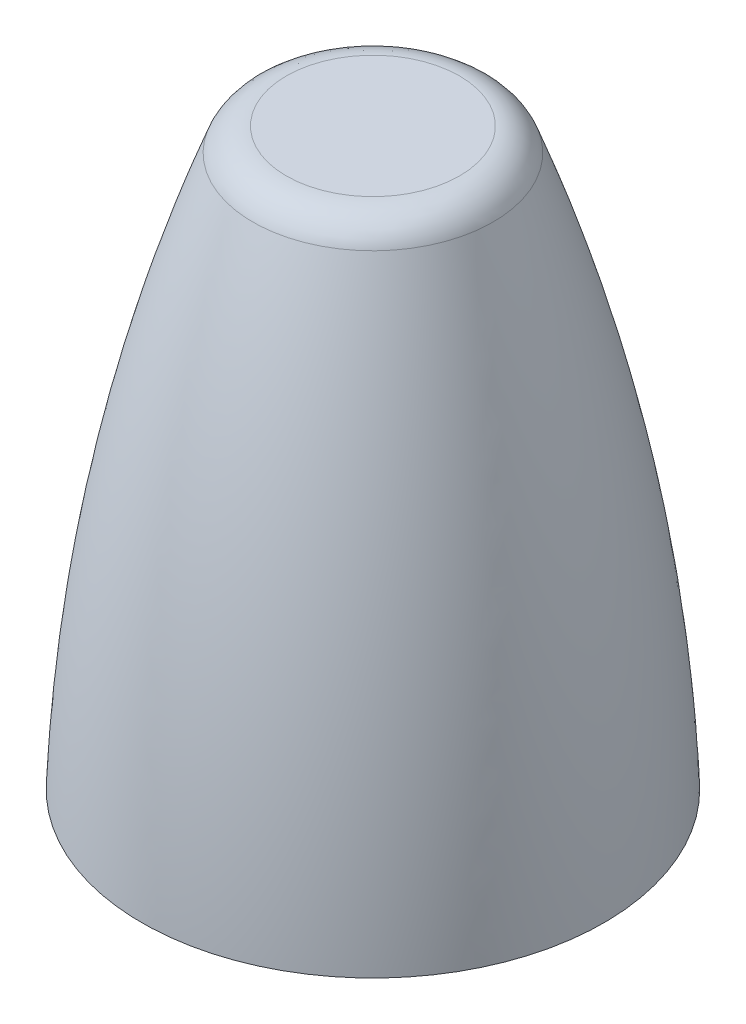
ISO-10303-21;
HEADER;
FILE_DESCRIPTION(('STEP AP214'),'2;1');
FILE_NAME('part.step','',(''),(''),'','','');
FILE_SCHEMA(('AUTOMOTIVE_DESIGN { 1 0 10303 214 1 1 1 1 }'));
ENDSEC;
DATA;
#1=APPLICATION_CONTEXT('core data for automotive mechanical design processes');
#2=APPLICATION_PROTOCOL_DEFINITION('international standard','automotive_design',2000,#1);
#3=PRODUCT_CONTEXT('',#1,'mechanical');
#4=PRODUCT('Part','Part','',(#3));
#5=PRODUCT_RELATED_PRODUCT_CATEGORY('part','',(#4));
#6=PRODUCT_DEFINITION_FORMATION('','',#4);
#7=PRODUCT_DEFINITION_CONTEXT('part definition',#1,'design');
#8=PRODUCT_DEFINITION('design','',#6,#7);
#9=PRODUCT_DEFINITION_SHAPE('','',#8);
#10=(LENGTH_UNIT() NAMED_UNIT(*) SI_UNIT(.MILLI.,.METRE.));
#11=(NAMED_UNIT(*) PLANE_ANGLE_UNIT() SI_UNIT($,.RADIAN.));
#12=(NAMED_UNIT(*) SI_UNIT($,.STERADIAN.) SOLID_ANGLE_UNIT());
#13=UNCERTAINTY_MEASURE_WITH_UNIT(LENGTH_MEASURE(1.E-05),#10,'distance_accuracy_value','');
#14=(GEOMETRIC_REPRESENTATION_CONTEXT(3) GLOBAL_UNCERTAINTY_ASSIGNED_CONTEXT((#13)) GLOBAL_UNIT_ASSIGNED_CONTEXT((#10,
#11,#12)) REPRESENTATION_CONTEXT('',''));
#15=CARTESIAN_POINT('',(0.,0.,0.));
#16=DIRECTION('',(0.,0.,1.));
#17=DIRECTION('',(1.,0.,0.));
#18=AXIS2_PLACEMENT_3D('',#15,#16,#17);
#19=CARTESIAN_POINT('',(0.,31.4346111856191,0.));
#20=DIRECTION('',(0.,-1.,0.));
#21=DIRECTION('',(0.,0.,-1.));
#22=AXIS2_PLACEMENT_3D('',#19,#20,#21);
#23=PLANE('',#22);
#24=CARTESIAN_POINT('',(0.,31.4346111856594,0.));
#25=DIRECTION('',(0.,-1.,0.));
#26=DIRECTION('',(1.,0.,0.));
#27=AXIS2_PLACEMENT_3D('',#24,#25,#26);
#28=CIRCLE('',#27,5.130799999991);
#29=CARTESIAN_POINT('',(5.130799999991,31.4346111856594,0.));
#30=VERTEX_POINT('',#29);
#31=EDGE_CURVE('E115',#30,#30,#28,.T.);
#32=ORIENTED_EDGE('',*,*,#31,.T.);
#33=EDGE_LOOP('',(#32));
#34=FACE_BOUND('',#33,.T.);
#35=ADVANCED_FACE('F17',(#34),#23,.T.);
#36=CARTESIAN_POINT('',(0.,25.4097866329062,0.));
#37=DIRECTION('',(0.,-1.,0.));
#38=DIRECTION('',(1.,0.,0.));
#39=AXIS2_PLACEMENT_3D('',#36,#37,#38);
#40=CONICAL_SURFACE('',#39,6.73099999997362,0.25960730001697);
#41=CARTESIAN_POINT('',(0.,25.4097866328367,0.));
#42=DIRECTION('',(0.,-1.,0.));
#43=DIRECTION('',(0.,0.,-1.));
#44=AXIS2_PLACEMENT_3D('',#41,#42,#43);
#45=CIRCLE('',#44,6.731);
#46=CARTESIAN_POINT('',(0.,25.4097866328367,-6.731));
#47=VERTEX_POINT('',#46);
#48=EDGE_CURVE('E113',#47,#47,#45,.T.);
#49=ORIENTED_EDGE('',*,*,#48,.T.);
#50=EDGE_LOOP('',(#49));
#51=FACE_BOUND('',#50,.T.);
#52=ORIENTED_EDGE('',*,*,#31,.F.);
#53=EDGE_LOOP('',(#52));
#54=FACE_BOUND('',#53,.T.);
#55=ADVANCED_FACE('F390',(#51,#54),#40,.F.);
#56=CARTESIAN_POINT('',(0.,31.0037578537676,0.));
#57=DIRECTION('',(0.,-1.,0.));
#58=DIRECTION('',(0.,0.,-1.));
#59=AXIS2_PLACEMENT_3D('',#56,#57,#58);
#60=CYLINDRICAL_SURFACE('',#59,6.731);
#61=CARTESIAN_POINT('',(0.,24.8249911856191,0.));
#62=DIRECTION('',(0.,-1.,0.));
#63=DIRECTION('',(0.,0.,-1.));
#64=AXIS2_PLACEMENT_3D('',#61,#62,#63);
#65=CIRCLE('',#64,6.731);
#66=CARTESIAN_POINT('',(0.,24.8249911856191,-6.731));
#67=VERTEX_POINT('',#66);
#68=EDGE_CURVE('E68',#67,#67,#65,.T.);
#69=ORIENTED_EDGE('',*,*,#68,.T.);
#70=EDGE_LOOP('',(#69));
#71=FACE_BOUND('',#70,.T.);
#72=ORIENTED_EDGE('',*,*,#48,.F.);
#73=EDGE_LOOP('',(#72));
#74=FACE_BOUND('',#73,.T.);
#75=ADVANCED_FACE('F101',(#71,#74),#60,.F.);
#76=CARTESIAN_POINT('',(0.,24.8249911856191,0.));
#77=DIRECTION('',(0.,-1.,0.));
#78=DIRECTION('',(0.,0.,-1.));
#79=AXIS2_PLACEMENT_3D('',#76,#77,#78);
#80=TOROIDAL_SURFACE('',#79,6.23062,0.500380000000001);
#81=CARTESIAN_POINT('',(0.,24.3246111856191,0.));
#82=DIRECTION('',(0.,-1.,0.));
#83=DIRECTION('',(0.,0.,1.));
#84=AXIS2_PLACEMENT_3D('',#81,#82,#83);
#85=CIRCLE('',#84,6.23062);
#86=CARTESIAN_POINT('',(0.,24.3246111856191,-6.23062));
#87=VERTEX_POINT('',#86);
#88=CARTESIAN_POINT('',(0.,24.3246111856191,6.23062));
#89=VERTEX_POINT('',#88);
#90=EDGE_CURVE('E56',#87,#89,#85,.F.);
#91=ORIENTED_EDGE('',*,*,#90,.F.);
#92=CARTESIAN_POINT('',(0.,24.3246111856191,0.));
#93=DIRECTION('',(0.,-1.,0.));
#94=DIRECTION('',(0.,0.,-1.));
#95=AXIS2_PLACEMENT_3D('',#92,#93,#94);
#96=CIRCLE('',#95,6.23062);
#97=EDGE_CURVE('E54',#89,#87,#96,.F.);
#98=ORIENTED_EDGE('',*,*,#97,.F.);
#99=EDGE_LOOP('',(#91,#98));
#100=FACE_BOUND('',#99,.T.);
#101=ORIENTED_EDGE('',*,*,#68,.F.);
#102=EDGE_LOOP('',(#101));
#103=FACE_BOUND('',#102,.T.);
#104=ADVANCED_FACE('F58',(#100,#103),#80,.F.);
#105=CARTESIAN_POINT('',(0.,24.3246111856191,0.));
#106=DIRECTION('',(0.,1.,0.));
#107=DIRECTION('',(0.,0.,1.));
#108=AXIS2_PLACEMENT_3D('',#105,#106,#107);
#109=PLANE('',#108);
#110=ORIENTED_EDGE('',*,*,#97,.T.);
#111=ORIENTED_EDGE('',*,*,#90,.T.);
#112=EDGE_LOOP('',(#110,#111));
#113=FACE_BOUND('',#112,.T.);
#114=CARTESIAN_POINT('',(0.,24.3246111856191,0.));
#115=DIRECTION('',(0.,-1.,0.));
#116=DIRECTION('',(0.,0.,-1.));
#117=AXIS2_PLACEMENT_3D('',#114,#115,#116);
#118=CIRCLE('',#117,5.175);
#119=CARTESIAN_POINT('',(0.,24.3246111856191,-5.175));
#120=VERTEX_POINT('',#119);
#121=EDGE_CURVE('E62',#120,#120,#118,.T.);
#122=ORIENTED_EDGE('',*,*,#121,.T.);
#123=EDGE_LOOP('',(#122));
#124=FACE_BOUND('',#123,.T.);
#125=ADVANCED_FACE('F66',(#113,#124),#109,.T.);
#126=CARTESIAN_POINT('',(0.,31.0037578537676,0.));
#127=DIRECTION('',(0.,-1.,0.));
#128=DIRECTION('',(0.,0.,-1.));
#129=AXIS2_PLACEMENT_3D('',#126,#127,#128);
#130=CYLINDRICAL_SURFACE('',#129,5.175);
#131=CARTESIAN_POINT('',(0.,15.7722628656191,0.));
#132=DIRECTION('',(0.,-1.,0.));
#133=DIRECTION('',(0.,0.,-1.));
#134=AXIS2_PLACEMENT_3D('',#131,#132,#133);
#135=CIRCLE('',#134,5.175);
#136=CARTESIAN_POINT('',(0.,15.7722628656191,-5.175));
#137=VERTEX_POINT('',#136);
#138=EDGE_CURVE('E125',#137,#137,#135,.F.);
#139=ORIENTED_EDGE('',*,*,#138,.F.);
#140=EDGE_LOOP('',(#139));
#141=FACE_BOUND('',#140,.T.);
#142=ORIENTED_EDGE('',*,*,#121,.F.);
#143=EDGE_LOOP('',(#142));
#144=FACE_BOUND('',#143,.T.);
#145=ADVANCED_FACE('F87',(#141,#144),#130,.F.);
#146=CARTESIAN_POINT('',(0.,15.7722628656191,0.));
#147=DIRECTION('',(0.,-1.,0.));
#148=DIRECTION('',(0.,0.,-1.));
#149=AXIS2_PLACEMENT_3D('',#146,#147,#148);
#150=PLANE('',#149);
#151=ORIENTED_EDGE('',*,*,#138,.T.);
#152=EDGE_LOOP('',(#151));
#153=FACE_BOUND('',#152,.T.);
#154=CARTESIAN_POINT('',(0.,15.7722628656191,0.));
#155=DIRECTION('',(0.,1.,0.));
#156=DIRECTION('',(0.,0.,1.));
#157=AXIS2_PLACEMENT_3D('',#154,#155,#156);
#158=CIRCLE('',#157,7.779);
#159=CARTESIAN_POINT('',(0.,15.7722628656191,-7.779));
#160=VERTEX_POINT('',#159);
#161=CARTESIAN_POINT('',(0.,15.7722628656191,7.779));
#162=VERTEX_POINT('',#161);
#163=EDGE_CURVE('E218',#160,#162,#158,.F.);
#164=ORIENTED_EDGE('',*,*,#163,.T.);
#165=CARTESIAN_POINT('',(0.,15.7722628656191,0.));
#166=DIRECTION('',(0.,1.,0.));
#167=DIRECTION('',(0.,0.,-1.));
#168=AXIS2_PLACEMENT_3D('',#165,#166,#167);
#169=CIRCLE('',#168,7.779);
#170=EDGE_CURVE('E128',#162,#160,#169,.F.);
#171=ORIENTED_EDGE('',*,*,#170,.T.);
#172=EDGE_LOOP('',(#164,#171));
#173=FACE_BOUND('',#172,.T.);
#174=ADVANCED_FACE('F227',(#153,#173),#150,.T.);
#175=CARTESIAN_POINT('',(0.,13.7722628656191,0.));
#176=DIRECTION('',(0.,-1.,0.));
#177=DIRECTION('',(0.,0.,-1.));
#178=AXIS2_PLACEMENT_3D('',#175,#176,#177);
#179=TOROIDAL_SURFACE('',#178,7.779,2.);
#180=ORIENTED_EDGE('',*,*,#163,.F.);
#181=ORIENTED_EDGE('',*,*,#170,.F.);
#182=EDGE_LOOP('',(#180,#181));
#183=FACE_BOUND('',#182,.T.);
#184=CARTESIAN_POINT('',(0.,13.7722628656191,0.));
#185=DIRECTION('',(0.,-1.,0.));
#186=DIRECTION('',(0.,0.,-1.));
#187=AXIS2_PLACEMENT_3D('',#184,#185,#186);
#188=CIRCLE('',#187,9.779);
#189=CARTESIAN_POINT('',(0.,13.7722628656191,-9.779));
#190=VERTEX_POINT('',#189);
#191=EDGE_CURVE('E124',#190,#190,#188,.T.);
#192=ORIENTED_EDGE('',*,*,#191,.T.);
#193=EDGE_LOOP('',(#192));
#194=FACE_BOUND('',#193,.T.);
#195=ADVANCED_FACE('F222',(#183,#194),#179,.F.);
#196=CARTESIAN_POINT('',(0.,31.0037578537676,0.));
#197=DIRECTION('',(0.,-1.,0.));
#198=DIRECTION('',(0.,0.,-1.));
#199=AXIS2_PLACEMENT_3D('',#196,#197,#198);
#200=CYLINDRICAL_SURFACE('',#199,9.779);
#201=ORIENTED_EDGE('',*,*,#191,.F.);
#202=EDGE_LOOP('',(#201));
#203=FACE_BOUND('',#202,.T.);
#204=CARTESIAN_POINT('',(0.,9.85961118561913,0.));
#205=DIRECTION('',(0.,-1.,0.));
#206=DIRECTION('',(0.,0.,-1.));
#207=AXIS2_PLACEMENT_3D('',#204,#205,#206);
#208=CIRCLE('',#207,9.779);
#209=CARTESIAN_POINT('',(0.,9.85961118561913,-9.779));
#210=VERTEX_POINT('',#209);
#211=EDGE_CURVE('E121',#210,#210,#208,.T.);
#212=ORIENTED_EDGE('',*,*,#211,.T.);
#213=EDGE_LOOP('',(#212));
#214=FACE_BOUND('',#213,.T.);
#215=ADVANCED_FACE('F226',(#203,#214),#200,.F.);
#216=CARTESIAN_POINT('',(0.,9.85961118561913,0.));
#217=DIRECTION('',(0.,-1.,0.));
#218=DIRECTION('',(0.,0.,-1.));
#219=AXIS2_PLACEMENT_3D('',#216,#217,#218);
#220=PLANE('',#219);
#221=CARTESIAN_POINT('',(0.,9.85961118561913,0.));
#222=DIRECTION('',(0.,-1.,0.));
#223=DIRECTION('',(0.,0.,-1.));
#224=AXIS2_PLACEMENT_3D('',#221,#222,#223);
#225=CIRCLE('',#224,6.15);
#226=CARTESIAN_POINT('',(0.,9.85961118561913,-6.15));
#227=VERTEX_POINT('',#226);
#228=EDGE_CURVE('E117',#227,#227,#225,.T.);
#229=ORIENTED_EDGE('',*,*,#228,.T.);
#230=EDGE_LOOP('',(#229));
#231=FACE_BOUND('',#230,.T.);
#232=ORIENTED_EDGE('',*,*,#211,.F.);
#233=EDGE_LOOP('',(#232));
#234=FACE_BOUND('',#233,.T.);
#235=ADVANCED_FACE('F297',(#231,#234),#220,.F.);
#236=CARTESIAN_POINT('',(0.,31.0037578537676,0.));
#237=DIRECTION('',(0.,-1.,0.));
#238=DIRECTION('',(0.,0.,-1.));
#239=AXIS2_PLACEMENT_3D('',#236,#237,#238);
#240=CYLINDRICAL_SURFACE('',#239,6.15);
#241=ORIENTED_EDGE('',*,*,#228,.F.);
#242=EDGE_LOOP('',(#241));
#243=FACE_BOUND('',#242,.T.);
#244=CARTESIAN_POINT('',(0.,5.39961118561913,0.));
#245=DIRECTION('',(0.,-1.,0.));
#246=DIRECTION('',(0.,0.,-1.));
#247=AXIS2_PLACEMENT_3D('',#244,#245,#246);
#248=CIRCLE('',#247,6.15);
#249=CARTESIAN_POINT('',(0.,5.39961118561913,-6.15));
#250=VERTEX_POINT('',#249);
#251=EDGE_CURVE('E120',#250,#250,#248,.F.);
#252=ORIENTED_EDGE('',*,*,#251,.F.);
#253=EDGE_LOOP('',(#252));
#254=FACE_BOUND('',#253,.T.);
#255=ADVANCED_FACE('F194',(#243,#254),#240,.F.);
#256=CARTESIAN_POINT('',(0.,35.,0.));
#257=DIRECTION('',(0.,-1.,0.));
#258=DIRECTION('',(0.,0.,-1.));
#259=AXIS2_PLACEMENT_3D('',#256,#257,#258);
#260=PLANE('',#259);
#261=CARTESIAN_POINT('',(0.,35.,0.));
#262=DIRECTION('',(0.,-1.,0.));
#263=DIRECTION('',(0.,0.,1.));
#264=AXIS2_PLACEMENT_3D('',#261,#262,#263);
#265=CIRCLE('',#264,4.84602357836034);
#266=CARTESIAN_POINT('',(0.,35.,4.84602357836034));
#267=VERTEX_POINT('',#266);
#268=CARTESIAN_POINT('',(0.,35.,-4.84602357836034));
#269=VERTEX_POINT('',#268);
#270=EDGE_CURVE('E138',#267,#269,#265,.T.);
#271=ORIENTED_EDGE('',*,*,#270,.F.);
#272=CARTESIAN_POINT('',(0.,35.,0.));
#273=DIRECTION('',(0.,-1.,0.));
#274=DIRECTION('',(0.,0.,-1.));
#275=AXIS2_PLACEMENT_3D('',#272,#273,#274);
#276=CIRCLE('',#275,4.84602357836034);
#277=EDGE_CURVE('E205',#269,#267,#276,.T.);
#278=ORIENTED_EDGE('',*,*,#277,.F.);
#279=EDGE_LOOP('',(#271,#278));
#280=FACE_BOUND('',#279,.T.);
#281=ADVANCED_FACE('F185',(#280),#260,.F.);
#282=CARTESIAN_POINT('',(0.,5.39961118561913,0.));
#283=DIRECTION('',(0.,-1.,0.));
#284=DIRECTION('',(0.,0.,-1.));
#285=AXIS2_PLACEMENT_3D('',#282,#283,#284);
#286=TOROIDAL_SURFACE('',#285,8.69,2.54);
#287=ORIENTED_EDGE('',*,*,#251,.T.);
#288=EDGE_LOOP('',(#287));
#289=FACE_BOUND('',#288,.T.);
#290=CARTESIAN_POINT('',(0.,2.85961118561913,0.));
#291=DIRECTION('',(0.,-1.,0.));
#292=DIRECTION('',(0.,0.,-1.));
#293=AXIS2_PLACEMENT_3D('',#290,#291,#292);
#294=CIRCLE('',#293,8.69);
#295=CARTESIAN_POINT('',(0.,2.85961118561913,8.69));
#296=VERTEX_POINT('',#295);
#297=CARTESIAN_POINT('',(0.,2.85961118561913,-8.69));
#298=VERTEX_POINT('',#297);
#299=EDGE_CURVE('E36',#296,#298,#294,.F.);
#300=ORIENTED_EDGE('',*,*,#299,.F.);
#301=CARTESIAN_POINT('',(0.,2.85961118561913,0.));
#302=DIRECTION('',(0.,-1.,0.));
#303=DIRECTION('',(0.,0.,1.));
#304=AXIS2_PLACEMENT_3D('',#301,#302,#303);
#305=CIRCLE('',#304,8.69);
#306=EDGE_CURVE('E272',#298,#296,#305,.F.);
#307=ORIENTED_EDGE('',*,*,#306,.F.);
#308=EDGE_LOOP('',(#300,#307));
#309=FACE_BOUND('',#308,.T.);
#310=ADVANCED_FACE('F156',(#289,#309),#286,.T.);
#311=CARTESIAN_POINT('',(0.,33.,0.));
#312=DIRECTION('',(0.,-1.,0.));
#313=DIRECTION('',(0.,0.,-1.));
#314=AXIS2_PLACEMENT_3D('',#311,#312,#313);
#315=TOROIDAL_SURFACE('',#314,4.84602357836034,1.99999999999999);
#316=CARTESIAN_POINT('',(0.,33.7010309278351,0.));
#317=DIRECTION('',(0.,-1.,0.));
#318=DIRECTION('',(0.,0.,-1.));
#319=AXIS2_PLACEMENT_3D('',#316,#317,#318);
#320=CIRCLE('',#319,6.71913746657392);
#321=CARTESIAN_POINT('',(0.,33.7010309278351,-6.71913746657392));
#322=VERTEX_POINT('',#321);
#323=EDGE_CURVE('E28',#322,#322,#320,.T.);
#324=ORIENTED_EDGE('',*,*,#323,.F.);
#325=EDGE_LOOP('',(#324));
#326=FACE_BOUND('',#325,.T.);
#327=ORIENTED_EDGE('',*,*,#277,.T.);
#328=ORIENTED_EDGE('',*,*,#270,.T.);
#329=EDGE_LOOP('',(#327,#328));
#330=FACE_BOUND('',#329,.T.);
#331=ADVANCED_FACE('F144',(#326,#330),#315,.T.);
#332=CARTESIAN_POINT('',(0.,2.85961118561913,0.));
#333=DIRECTION('',(0.,-1.,0.));
#334=DIRECTION('',(0.,0.,-1.));
#335=AXIS2_PLACEMENT_3D('',#332,#333,#334);
#336=PLANE('',#335);
#337=CARTESIAN_POINT('',(0.,2.85961118561913,0.));
#338=DIRECTION('',(0.,-1.,0.));
#339=DIRECTION('',(0.,0.,-1.));
#340=AXIS2_PLACEMENT_3D('',#337,#338,#339);
#341=CIRCLE('',#340,12.9247360446104);
#342=CARTESIAN_POINT('',(0.,2.85961118561913,-12.9247360446104));
#343=VERTEX_POINT('',#342);
#344=EDGE_CURVE('E11',#343,#343,#341,.F.);
#345=ORIENTED_EDGE('',*,*,#344,.F.);
#346=EDGE_LOOP('',(#345));
#347=FACE_BOUND('',#346,.T.);
#348=ORIENTED_EDGE('',*,*,#306,.T.);
#349=ORIENTED_EDGE('',*,*,#299,.T.);
#350=EDGE_LOOP('',(#348,#349));
#351=FACE_BOUND('',#350,.T.);
#352=ADVANCED_FACE('F155',(#347,#351),#336,.T.);
#353=CARTESIAN_POINT('',(0.,-0.999999999999997,86.));
#354=DIRECTION('',(1.,0.,0.));
#355=DIRECTION('',(0.,0.,-1.));
#356=AXIS2_PLACEMENT_3D('',#353,#354,#355);
#357=CIRCLE('',#356,99.);
#358=TRIMMED_CURVE('',#357,(PARAMETER_VALUE(-0.518251053656304)),
(PARAMETER_VALUE(0.518251053656304)),.T.,.PARAMETER.);
#359=CARTESIAN_POINT('',(0.,-0.999999999999997,0.));
#360=DIRECTION('',(0.,-1.,0.));
#361=AXIS1_PLACEMENT('',#359,#360);
#362=SURFACE_OF_REVOLUTION('',#358,#361);
#363=ORIENTED_EDGE('',*,*,#344,.T.);
#364=EDGE_LOOP('',(#363));
#365=FACE_BOUND('',#364,.T.);
#366=ORIENTED_EDGE('',*,*,#323,.T.);
#367=EDGE_LOOP('',(#366));
#368=FACE_BOUND('',#367,.T.);
#369=ADVANCED_FACE('F259',(#365,#368),#362,.F.);
#370=CLOSED_SHELL('',(#35,#55,#75,#104,#125,#145,#174,#195,#215,#235,#255,#281,#310,#331,#352,#369));
#371=MANIFOLD_SOLID_BREP('B1',#370);
#372=ADVANCED_BREP_SHAPE_REPRESENTATION('',(#18,#371),#14);
#373=SHAPE_DEFINITION_REPRESENTATION(#9,#372);
ENDSEC;
END-ISO-10303-21;
